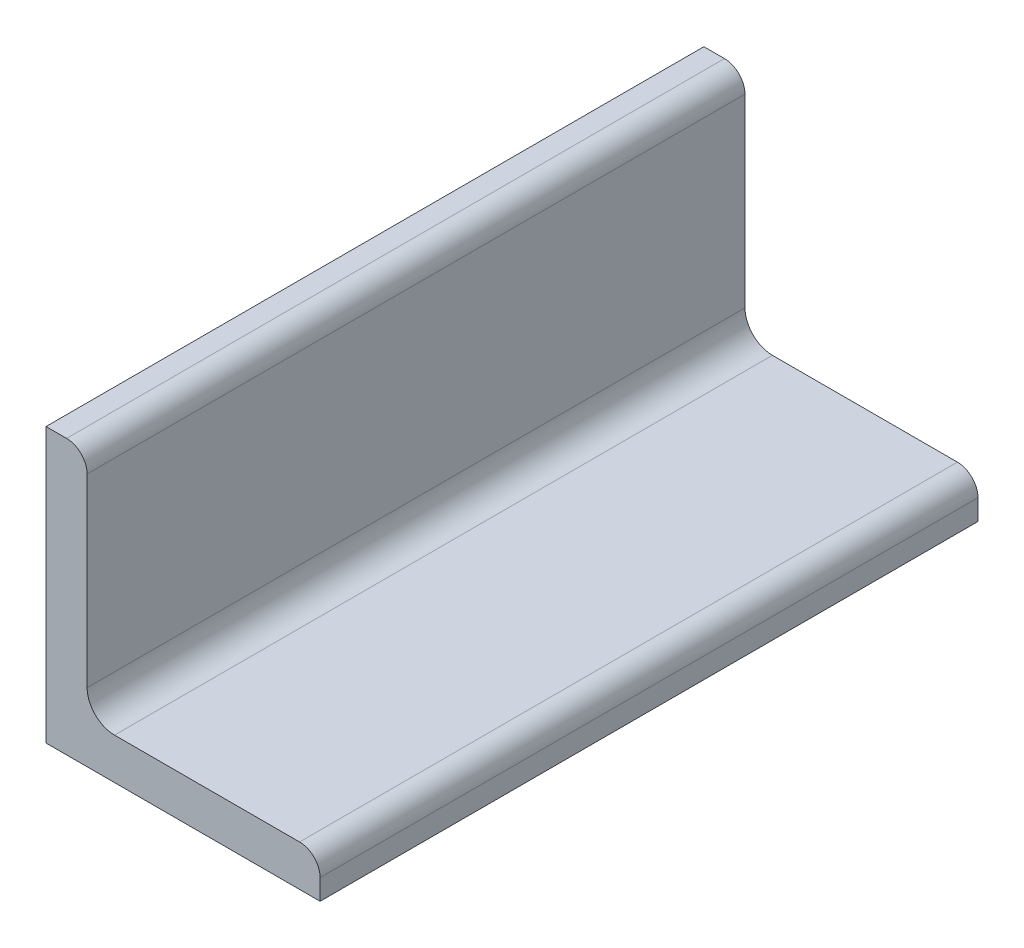
ISO-10303-21;
HEADER;
FILE_DESCRIPTION(('STEP AP214'),'2;1');
FILE_NAME('part.step','',(''),(''),'','','');
FILE_SCHEMA(('AUTOMOTIVE_DESIGN { 1 0 10303 214 1 1 1 1 }'));
ENDSEC;
DATA;
#1=APPLICATION_CONTEXT('core data for automotive mechanical design processes');
#2=APPLICATION_PROTOCOL_DEFINITION('international standard','automotive_design',2000,#1);
#3=PRODUCT_CONTEXT('',#1,'mechanical');
#4=PRODUCT('Part','Part','',(#3));
#5=PRODUCT_RELATED_PRODUCT_CATEGORY('part','',(#4));
#6=PRODUCT_DEFINITION_FORMATION('','',#4);
#7=PRODUCT_DEFINITION_CONTEXT('part definition',#1,'design');
#8=PRODUCT_DEFINITION('design','',#6,#7);
#9=PRODUCT_DEFINITION_SHAPE('','',#8);
#10=(LENGTH_UNIT() NAMED_UNIT(*) SI_UNIT(.MILLI.,.METRE.));
#11=(NAMED_UNIT(*) PLANE_ANGLE_UNIT() SI_UNIT($,.RADIAN.));
#12=(NAMED_UNIT(*) SI_UNIT($,.STERADIAN.) SOLID_ANGLE_UNIT());
#13=UNCERTAINTY_MEASURE_WITH_UNIT(LENGTH_MEASURE(1.E-05),#10,'distance_accuracy_value','');
#14=(GEOMETRIC_REPRESENTATION_CONTEXT(3) GLOBAL_UNCERTAINTY_ASSIGNED_CONTEXT((#13)) GLOBAL_UNIT_ASSIGNED_CONTEXT((#10,
#11,#12)) REPRESENTATION_CONTEXT('',''));
#15=CARTESIAN_POINT('',(0.,0.,0.));
#16=DIRECTION('',(0.,0.,1.));
#17=DIRECTION('',(1.,0.,0.));
#18=AXIS2_PLACEMENT_3D('',#15,#16,#17);
#19=CARTESIAN_POINT('',(0.0507450451214936,127.041655270204,304.8));
#20=DIRECTION('',(1.,0.,0.));
#21=DIRECTION('',(0.,0.,-1.));
#22=AXIS2_PLACEMENT_3D('',#19,#20,#21);
#23=PLANE('',#22);
#24=DIRECTION('',(0.,-1.,0.));
#25=VECTOR('',#24,1.);
#26=CARTESIAN_POINT('',(0.0507450451214936,127.041655270204,0.));
#27=LINE('',#26,#25);
#28=CARTESIAN_POINT('',(0.0507450451214936,127.041655270204,0.));
#29=VERTEX_POINT('',#28);
#30=CARTESIAN_POINT('',(0.0507450451214936,0.0416552702040917,0.));
#31=VERTEX_POINT('',#30);
#32=EDGE_CURVE('E135',#29,#31,#27,.T.);
#33=ORIENTED_EDGE('',*,*,#32,.T.);
#34=DIRECTION('',(0.,0.,-1.));
#35=VECTOR('',#34,1.);
#36=CARTESIAN_POINT('',(0.0507450451214936,0.0416552702040917,304.8));
#37=LINE('',#36,#35);
#38=CARTESIAN_POINT('',(0.0507450451214936,0.0416552702040917,304.8));
#39=VERTEX_POINT('',#38);
#40=EDGE_CURVE('E11',#39,#31,#37,.T.);
#41=ORIENTED_EDGE('',*,*,#40,.F.);
#42=DIRECTION('',(0.,-1.,0.));
#43=VECTOR('',#42,1.);
#44=CARTESIAN_POINT('',(0.0507450451214936,127.041655270204,304.8));
#45=LINE('',#44,#43);
#46=CARTESIAN_POINT('',(0.0507450451214936,127.041655270204,304.8));
#47=VERTEX_POINT('',#46);
#48=EDGE_CURVE('E151',#47,#39,#45,.T.);
#49=ORIENTED_EDGE('',*,*,#48,.F.);
#50=DIRECTION('',(0.,0.,-1.));
#51=VECTOR('',#50,1.);
#52=CARTESIAN_POINT('',(0.0507450451214936,127.041655270204,304.8));
#53=LINE('',#52,#51);
#54=EDGE_CURVE('E131',#47,#29,#53,.T.);
#55=ORIENTED_EDGE('',*,*,#54,.T.);
#56=EDGE_LOOP('',(#33,#41,#49,#55));
#57=FACE_BOUND('',#56,.T.);
#58=ADVANCED_FACE('F33',(#57),#23,.F.);
#59=CARTESIAN_POINT('',(0.0507450451214936,0.0416552702040917,304.8));
#60=DIRECTION('',(0.,1.,0.));
#61=DIRECTION('',(0.,0.,1.));
#62=AXIS2_PLACEMENT_3D('',#59,#60,#61);
#63=PLANE('',#62);
#64=DIRECTION('',(1.,0.,0.));
#65=VECTOR('',#64,1.);
#66=CARTESIAN_POINT('',(0.0507450451214936,0.0416552702040917,0.));
#67=LINE('',#66,#65);
#68=CARTESIAN_POINT('',(127.050745045121,0.0416552702040917,0.));
#69=VERTEX_POINT('',#68);
#70=EDGE_CURVE('E138',#31,#69,#67,.T.);
#71=ORIENTED_EDGE('',*,*,#70,.T.);
#72=DIRECTION('',(0.,0.,-1.));
#73=VECTOR('',#72,1.);
#74=CARTESIAN_POINT('',(127.050745045121,0.0416552702040917,304.8));
#75=LINE('',#74,#73);
#76=CARTESIAN_POINT('',(127.050745045121,0.0416552702040917,304.8));
#77=VERTEX_POINT('',#76);
#78=EDGE_CURVE('E41',#77,#69,#75,.T.);
#79=ORIENTED_EDGE('',*,*,#78,.F.);
#80=DIRECTION('',(1.,0.,0.));
#81=VECTOR('',#80,1.);
#82=CARTESIAN_POINT('',(0.0507450451214936,0.0416552702040917,304.8));
#83=LINE('',#82,#81);
#84=EDGE_CURVE('E95',#39,#77,#83,.T.);
#85=ORIENTED_EDGE('',*,*,#84,.F.);
#86=ORIENTED_EDGE('',*,*,#40,.T.);
#87=EDGE_LOOP('',(#71,#79,#85,#86));
#88=FACE_BOUND('',#87,.T.);
#89=ADVANCED_FACE('F194',(#88),#63,.F.);
#90=CARTESIAN_POINT('',(127.050745045121,0.0416552702040917,304.8));
#91=DIRECTION('',(-1.,0.,0.));
#92=DIRECTION('',(0.,0.,1.));
#93=AXIS2_PLACEMENT_3D('',#90,#91,#92);
#94=PLANE('',#93);
#95=DIRECTION('',(0.,1.,0.));
#96=VECTOR('',#95,1.);
#97=CARTESIAN_POINT('',(127.050745045121,0.0416552702040917,0.));
#98=LINE('',#97,#96);
#99=CARTESIAN_POINT('',(127.050745045121,9.56665527020409,0.));
#100=VERTEX_POINT('',#99);
#101=EDGE_CURVE('E140',#69,#100,#98,.T.);
#102=ORIENTED_EDGE('',*,*,#101,.T.);
#103=DIRECTION('',(0.,0.,-1.));
#104=VECTOR('',#103,1.);
#105=CARTESIAN_POINT('',(127.050745045121,9.56665527020409,304.8));
#106=LINE('',#105,#104);
#107=CARTESIAN_POINT('',(127.050745045121,9.56665527020409,304.8));
#108=VERTEX_POINT('',#107);
#109=EDGE_CURVE('E161',#108,#100,#106,.T.);
#110=ORIENTED_EDGE('',*,*,#109,.F.);
#111=DIRECTION('',(0.,1.,0.));
#112=VECTOR('',#111,1.);
#113=CARTESIAN_POINT('',(127.050745045121,0.0416552702040917,304.8));
#114=LINE('',#113,#112);
#115=EDGE_CURVE('E169',#77,#108,#114,.T.);
#116=ORIENTED_EDGE('',*,*,#115,.F.);
#117=ORIENTED_EDGE('',*,*,#78,.T.);
#118=EDGE_LOOP('',(#102,#110,#116,#117));
#119=FACE_BOUND('',#118,.T.);
#120=ADVANCED_FACE('F167',(#119),#94,.F.);
#121=CARTESIAN_POINT('',(117.525745045121,9.56665527020409,304.8));
#122=DIRECTION('',(0.,0.,-1.));
#123=DIRECTION('',(-1.,0.,0.));
#124=AXIS2_PLACEMENT_3D('',#121,#122,#123);
#125=CYLINDRICAL_SURFACE('',#124,9.525);
#126=CARTESIAN_POINT('',(117.525745045121,9.56665527020409,0.));
#127=DIRECTION('',(0.,0.,1.));
#128=DIRECTION('',(1.,0.,0.));
#129=AXIS2_PLACEMENT_3D('',#126,#127,#128);
#130=CIRCLE('',#129,9.525);
#131=CARTESIAN_POINT('',(117.525745045121,19.0916552702041,0.));
#132=VERTEX_POINT('',#131);
#133=EDGE_CURVE('E142',#100,#132,#130,.T.);
#134=ORIENTED_EDGE('',*,*,#133,.T.);
#135=DIRECTION('',(0.,0.,-1.));
#136=VECTOR('',#135,1.);
#137=CARTESIAN_POINT('',(117.525745045121,19.0916552702041,304.8));
#138=LINE('',#137,#136);
#139=CARTESIAN_POINT('',(117.525745045121,19.0916552702041,304.8));
#140=VERTEX_POINT('',#139);
#141=EDGE_CURVE('E158',#140,#132,#138,.T.);
#142=ORIENTED_EDGE('',*,*,#141,.F.);
#143=CARTESIAN_POINT('',(117.525745045121,9.56665527020409,304.8));
#144=DIRECTION('',(0.,0.,1.));
#145=DIRECTION('',(1.,0.,0.));
#146=AXIS2_PLACEMENT_3D('',#143,#144,#145);
#147=CIRCLE('',#146,9.525);
#148=EDGE_CURVE('E185',#108,#140,#147,.T.);
#149=ORIENTED_EDGE('',*,*,#148,.F.);
#150=ORIENTED_EDGE('',*,*,#109,.T.);
#151=EDGE_LOOP('',(#134,#142,#149,#150));
#152=FACE_BOUND('',#151,.T.);
#153=ADVANCED_FACE('F178',(#152),#125,.T.);
#154=CARTESIAN_POINT('',(117.525745045121,19.0916552702041,304.8));
#155=DIRECTION('',(0.,-1.,0.));
#156=DIRECTION('',(0.,0.,-1.));
#157=AXIS2_PLACEMENT_3D('',#154,#155,#156);
#158=PLANE('',#157);
#159=DIRECTION('',(-1.,0.,0.));
#160=VECTOR('',#159,1.);
#161=CARTESIAN_POINT('',(117.525745045121,19.0916552702041,0.));
#162=LINE('',#161,#160);
#163=CARTESIAN_POINT('',(31.8007450451215,19.0916552702041,0.));
#164=VERTEX_POINT('',#163);
#165=EDGE_CURVE('E144',#132,#164,#162,.T.);
#166=ORIENTED_EDGE('',*,*,#165,.T.);
#167=DIRECTION('',(0.,0.,-1.));
#168=VECTOR('',#167,1.);
#169=CARTESIAN_POINT('',(31.8007450451215,19.0916552702041,304.8));
#170=LINE('',#169,#168);
#171=CARTESIAN_POINT('',(31.8007450451215,19.0916552702041,304.8));
#172=VERTEX_POINT('',#171);
#173=EDGE_CURVE('E155',#172,#164,#170,.T.);
#174=ORIENTED_EDGE('',*,*,#173,.F.);
#175=DIRECTION('',(-1.,0.,0.));
#176=VECTOR('',#175,1.);
#177=CARTESIAN_POINT('',(117.525745045121,19.0916552702041,304.8));
#178=LINE('',#177,#176);
#179=EDGE_CURVE('E184',#140,#172,#178,.T.);
#180=ORIENTED_EDGE('',*,*,#179,.F.);
#181=ORIENTED_EDGE('',*,*,#141,.T.);
#182=EDGE_LOOP('',(#166,#174,#180,#181));
#183=FACE_BOUND('',#182,.T.);
#184=ADVANCED_FACE('F182',(#183),#158,.F.);
#185=CARTESIAN_POINT('',(31.8007450451215,31.7916552702041,304.8));
#186=DIRECTION('',(0.,0.,-1.));
#187=DIRECTION('',(-1.,0.,0.));
#188=AXIS2_PLACEMENT_3D('',#185,#186,#187);
#189=CYLINDRICAL_SURFACE('',#188,12.7);
#190=CARTESIAN_POINT('',(31.8007450451215,31.7916552702041,0.));
#191=DIRECTION('',(0.,0.,-1.));
#192=DIRECTION('',(1.,0.,0.));
#193=AXIS2_PLACEMENT_3D('',#190,#191,#192);
#194=CIRCLE('',#193,12.7);
#195=CARTESIAN_POINT('',(19.1007450451215,31.7916552702041,0.));
#196=VERTEX_POINT('',#195);
#197=EDGE_CURVE('E146',#164,#196,#194,.T.);
#198=ORIENTED_EDGE('',*,*,#197,.T.);
#199=DIRECTION('',(0.,0.,-1.));
#200=VECTOR('',#199,1.);
#201=CARTESIAN_POINT('',(19.1007450451215,31.7916552702041,304.8));
#202=LINE('',#201,#200);
#203=CARTESIAN_POINT('',(19.1007450451215,31.7916552702041,304.8));
#204=VERTEX_POINT('',#203);
#205=EDGE_CURVE('E126',#204,#196,#202,.T.);
#206=ORIENTED_EDGE('',*,*,#205,.F.);
#207=CARTESIAN_POINT('',(31.8007450451215,31.7916552702041,304.8));
#208=DIRECTION('',(0.,0.,-1.));
#209=DIRECTION('',(1.,0.,0.));
#210=AXIS2_PLACEMENT_3D('',#207,#208,#209);
#211=CIRCLE('',#210,12.7);
#212=EDGE_CURVE('E117',#172,#204,#211,.T.);
#213=ORIENTED_EDGE('',*,*,#212,.F.);
#214=ORIENTED_EDGE('',*,*,#173,.T.);
#215=EDGE_LOOP('',(#198,#206,#213,#214));
#216=FACE_BOUND('',#215,.T.);
#217=ADVANCED_FACE('F206',(#216),#189,.F.);
#218=CARTESIAN_POINT('',(19.1007450451215,31.7916552702041,304.8));
#219=DIRECTION('',(-1.,0.,0.));
#220=DIRECTION('',(0.,0.,1.));
#221=AXIS2_PLACEMENT_3D('',#218,#219,#220);
#222=PLANE('',#221);
#223=DIRECTION('',(0.,1.,0.));
#224=VECTOR('',#223,1.);
#225=CARTESIAN_POINT('',(19.1007450451215,31.7916552702041,0.));
#226=LINE('',#225,#224);
#227=CARTESIAN_POINT('',(19.1007450451215,117.516655270204,0.));
#228=VERTEX_POINT('',#227);
#229=EDGE_CURVE('E125',#196,#228,#226,.T.);
#230=ORIENTED_EDGE('',*,*,#229,.T.);
#231=DIRECTION('',(0.,0.,-1.));
#232=VECTOR('',#231,1.);
#233=CARTESIAN_POINT('',(19.1007450451215,117.516655270204,304.8));
#234=LINE('',#233,#232);
#235=CARTESIAN_POINT('',(19.1007450451215,117.516655270204,304.8));
#236=VERTEX_POINT('',#235);
#237=EDGE_CURVE('E122',#236,#228,#234,.T.);
#238=ORIENTED_EDGE('',*,*,#237,.F.);
#239=DIRECTION('',(0.,1.,0.));
#240=VECTOR('',#239,1.);
#241=CARTESIAN_POINT('',(19.1007450451215,31.7916552702041,304.8));
#242=LINE('',#241,#240);
#243=EDGE_CURVE('E111',#204,#236,#242,.T.);
#244=ORIENTED_EDGE('',*,*,#243,.F.);
#245=ORIENTED_EDGE('',*,*,#205,.T.);
#246=EDGE_LOOP('',(#230,#238,#244,#245));
#247=FACE_BOUND('',#246,.T.);
#248=ADVANCED_FACE('F123',(#247),#222,.F.);
#249=CARTESIAN_POINT('',(9.5757450451215,117.516655270204,304.8));
#250=DIRECTION('',(0.,0.,-1.));
#251=DIRECTION('',(-1.,0.,0.));
#252=AXIS2_PLACEMENT_3D('',#249,#250,#251);
#253=CYLINDRICAL_SURFACE('',#252,9.52500000000001);
#254=CARTESIAN_POINT('',(9.5757450451215,117.516655270204,0.));
#255=DIRECTION('',(0.,0.,1.));
#256=DIRECTION('',(1.,0.,0.));
#257=AXIS2_PLACEMENT_3D('',#254,#255,#256);
#258=CIRCLE('',#257,9.52500000000001);
#259=CARTESIAN_POINT('',(9.57574504512149,127.041655270204,0.));
#260=VERTEX_POINT('',#259);
#261=EDGE_CURVE('E81',#228,#260,#258,.T.);
#262=ORIENTED_EDGE('',*,*,#261,.T.);
#263=DIRECTION('',(0.,0.,-1.));
#264=VECTOR('',#263,1.);
#265=CARTESIAN_POINT('',(9.57574504512149,127.041655270204,304.8));
#266=LINE('',#265,#264);
#267=CARTESIAN_POINT('',(9.57574504512149,127.041655270204,304.8));
#268=VERTEX_POINT('',#267);
#269=EDGE_CURVE('E127',#268,#260,#266,.T.);
#270=ORIENTED_EDGE('',*,*,#269,.F.);
#271=CARTESIAN_POINT('',(9.5757450451215,117.516655270204,304.8));
#272=DIRECTION('',(0.,0.,1.));
#273=DIRECTION('',(1.,0.,0.));
#274=AXIS2_PLACEMENT_3D('',#271,#272,#273);
#275=CIRCLE('',#274,9.52500000000001);
#276=EDGE_CURVE('E115',#236,#268,#275,.T.);
#277=ORIENTED_EDGE('',*,*,#276,.F.);
#278=ORIENTED_EDGE('',*,*,#237,.T.);
#279=EDGE_LOOP('',(#262,#270,#277,#278));
#280=FACE_BOUND('',#279,.T.);
#281=ADVANCED_FACE('F129',(#280),#253,.T.);
#282=CARTESIAN_POINT('',(9.57574504512149,127.041655270204,304.8));
#283=DIRECTION('',(0.,-1.,0.));
#284=DIRECTION('',(0.,0.,-1.));
#285=AXIS2_PLACEMENT_3D('',#282,#283,#284);
#286=PLANE('',#285);
#287=DIRECTION('',(-1.,0.,0.));
#288=VECTOR('',#287,1.);
#289=CARTESIAN_POINT('',(9.57574504512149,127.041655270204,0.));
#290=LINE('',#289,#288);
#291=EDGE_CURVE('E87',#260,#29,#290,.T.);
#292=ORIENTED_EDGE('',*,*,#291,.T.);
#293=ORIENTED_EDGE('',*,*,#54,.F.);
#294=DIRECTION('',(-1.,0.,0.));
#295=VECTOR('',#294,1.);
#296=CARTESIAN_POINT('',(9.57574504512149,127.041655270204,304.8));
#297=LINE('',#296,#295);
#298=EDGE_CURVE('E49',#268,#47,#297,.T.);
#299=ORIENTED_EDGE('',*,*,#298,.F.);
#300=ORIENTED_EDGE('',*,*,#269,.T.);
#301=EDGE_LOOP('',(#292,#293,#299,#300));
#302=FACE_BOUND('',#301,.T.);
#303=ADVANCED_FACE('F214',(#302),#286,.F.);
#304=CARTESIAN_POINT('',(117.525745045121,9.56665527020409,304.8));
#305=DIRECTION('',(0.,0.,1.));
#306=DIRECTION('',(1.,0.,0.));
#307=AXIS2_PLACEMENT_3D('',#304,#305,#306);
#308=PLANE('',#307);
#309=ORIENTED_EDGE('',*,*,#48,.T.);
#310=ORIENTED_EDGE('',*,*,#84,.T.);
#311=ORIENTED_EDGE('',*,*,#115,.T.);
#312=ORIENTED_EDGE('',*,*,#148,.T.);
#313=ORIENTED_EDGE('',*,*,#179,.T.);
#314=ORIENTED_EDGE('',*,*,#212,.T.);
#315=ORIENTED_EDGE('',*,*,#243,.T.);
#316=ORIENTED_EDGE('',*,*,#276,.T.);
#317=ORIENTED_EDGE('',*,*,#298,.T.);
#318=EDGE_LOOP('',(#309,#310,#311,#312,#313,#314,#315,#316,#317));
#319=FACE_BOUND('',#318,.T.);
#320=ADVANCED_FACE('F113',(#319),#308,.T.);
#321=CARTESIAN_POINT('',(117.525745045121,9.56665527020409,0.));
#322=DIRECTION('',(0.,0.,1.));
#323=DIRECTION('',(1.,0.,0.));
#324=AXIS2_PLACEMENT_3D('',#321,#322,#323);
#325=PLANE('',#324);
#326=ORIENTED_EDGE('',*,*,#32,.F.);
#327=ORIENTED_EDGE('',*,*,#291,.F.);
#328=ORIENTED_EDGE('',*,*,#261,.F.);
#329=ORIENTED_EDGE('',*,*,#229,.F.);
#330=ORIENTED_EDGE('',*,*,#197,.F.);
#331=ORIENTED_EDGE('',*,*,#165,.F.);
#332=ORIENTED_EDGE('',*,*,#133,.F.);
#333=ORIENTED_EDGE('',*,*,#101,.F.);
#334=ORIENTED_EDGE('',*,*,#70,.F.);
#335=EDGE_LOOP('',(#326,#327,#328,#329,#330,#331,#332,#333,#334));
#336=FACE_BOUND('',#335,.T.);
#337=ADVANCED_FACE('F173',(#336),#325,.F.);
#338=CLOSED_SHELL('',(#58,#89,#120,#153,#184,#217,#248,#281,#303,#320,#337));
#339=MANIFOLD_SOLID_BREP('B2',#338);
#340=ADVANCED_BREP_SHAPE_REPRESENTATION('',(#18,#339),#14);
#341=SHAPE_DEFINITION_REPRESENTATION(#9,#340);
ENDSEC;
END-ISO-10303-21;
